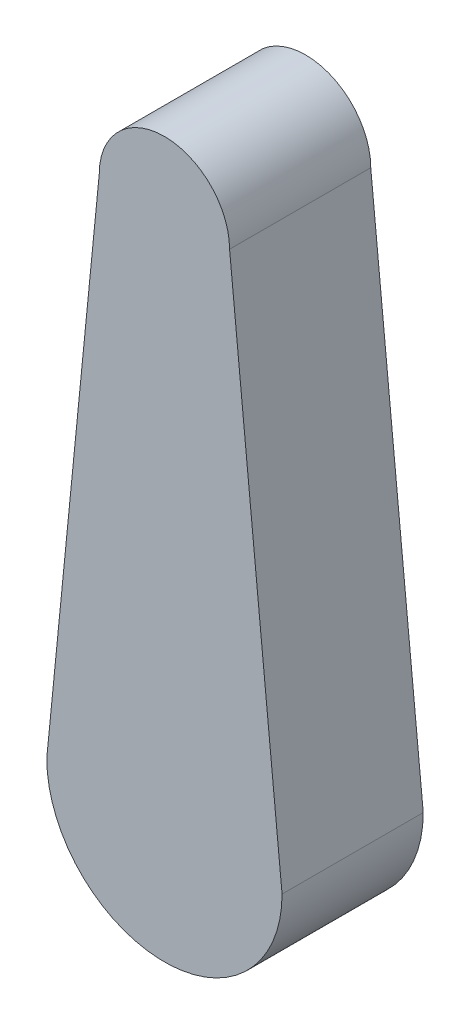
ISO-10303-21;
HEADER;
FILE_DESCRIPTION(('STEP AP214'),'2;1');
FILE_NAME('part.step','',(''),(''),'','','');
FILE_SCHEMA(('AUTOMOTIVE_DESIGN { 1 0 10303 214 1 1 1 1 }'));
ENDSEC;
DATA;
#1=APPLICATION_CONTEXT('core data for automotive mechanical design processes');
#2=APPLICATION_PROTOCOL_DEFINITION('international standard','automotive_design',2000,#1);
#3=PRODUCT_CONTEXT('',#1,'mechanical');
#4=PRODUCT('Part','Part','',(#3));
#5=PRODUCT_RELATED_PRODUCT_CATEGORY('part','',(#4));
#6=PRODUCT_DEFINITION_FORMATION('','',#4);
#7=PRODUCT_DEFINITION_CONTEXT('part definition',#1,'design');
#8=PRODUCT_DEFINITION('design','',#6,#7);
#9=PRODUCT_DEFINITION_SHAPE('','',#8);
#10=(LENGTH_UNIT() NAMED_UNIT(*) SI_UNIT(.MILLI.,.METRE.));
#11=(NAMED_UNIT(*) PLANE_ANGLE_UNIT() SI_UNIT($,.RADIAN.));
#12=(NAMED_UNIT(*) SI_UNIT($,.STERADIAN.) SOLID_ANGLE_UNIT());
#13=UNCERTAINTY_MEASURE_WITH_UNIT(LENGTH_MEASURE(1.E-05),#10,'distance_accuracy_value','');
#14=(GEOMETRIC_REPRESENTATION_CONTEXT(3) GLOBAL_UNCERTAINTY_ASSIGNED_CONTEXT((#13)) GLOBAL_UNIT_ASSIGNED_CONTEXT((#10,
#11,#12)) REPRESENTATION_CONTEXT('',''));
#15=CARTESIAN_POINT('',(0.,0.,0.));
#16=DIRECTION('',(0.,0.,1.));
#17=DIRECTION('',(1.,0.,0.));
#18=AXIS2_PLACEMENT_3D('',#15,#16,#17);
#19=CARTESIAN_POINT('',(-190.481077779291,76.9248464768424,-7.8));
#20=DIRECTION('',(0.,0.,1.));
#21=DIRECTION('',(1.,0.,0.));
#22=AXIS2_PLACEMENT_3D('',#19,#20,#21);
#23=CYLINDRICAL_SURFACE('',#22,6.50000000000001);
#24=CARTESIAN_POINT('',(-190.481077779291,76.9248464768424,0.));
#25=DIRECTION('',(0.,0.,1.));
#26=DIRECTION('',(1.,0.,0.));
#27=AXIS2_PLACEMENT_3D('',#24,#25,#26);
#28=CIRCLE('',#27,6.50000000000001);
#29=CARTESIAN_POINT('',(-196.981077779291,76.9248464768424,0.));
#30=VERTEX_POINT('',#29);
#31=CARTESIAN_POINT('',(-183.98107777929,76.9248464768424,0.));
#32=VERTEX_POINT('',#31);
#33=EDGE_CURVE('E121',#30,#32,#28,.T.);
#34=ORIENTED_EDGE('',*,*,#33,.F.);
#35=DIRECTION('',(0.,0.,1.));
#36=VECTOR('',#35,1.);
#37=CARTESIAN_POINT('',(-196.981077779291,76.9248464768424,-7.8));
#38=LINE('',#37,#36);
#39=CARTESIAN_POINT('',(-196.981077779291,76.9248464768424,-7.8));
#40=VERTEX_POINT('',#39);
#41=EDGE_CURVE('E11',#40,#30,#38,.T.);
#42=ORIENTED_EDGE('',*,*,#41,.F.);
#43=CARTESIAN_POINT('',(-190.481077779291,76.9248464768424,-7.8));
#44=DIRECTION('',(0.,0.,1.));
#45=DIRECTION('',(1.,0.,0.));
#46=AXIS2_PLACEMENT_3D('',#43,#44,#45);
#47=CIRCLE('',#46,6.50000000000001);
#48=CARTESIAN_POINT('',(-183.98107777929,76.9248464768424,-7.8));
#49=VERTEX_POINT('',#48);
#50=EDGE_CURVE('E111',#40,#49,#47,.T.);
#51=ORIENTED_EDGE('',*,*,#50,.T.);
#52=DIRECTION('',(0.,0.,1.));
#53=VECTOR('',#52,1.);
#54=CARTESIAN_POINT('',(-183.98107777929,76.9248464768424,-7.8));
#55=LINE('',#54,#53);
#56=EDGE_CURVE('E44',#49,#32,#55,.T.);
#57=ORIENTED_EDGE('',*,*,#56,.T.);
#58=EDGE_LOOP('',(#34,#42,#51,#57));
#59=FACE_BOUND('',#58,.T.);
#60=ADVANCED_FACE('F41',(#59),#23,.T.);
#61=CARTESIAN_POINT('',(-194.08107777929,106.324846476842,-7.8));
#62=DIRECTION('',(-0.995170343925355,0.0981630611354947,0.));
#63=DIRECTION('',(-0.0981630611354947,-0.995170343925355,0.));
#64=AXIS2_PLACEMENT_3D('',#61,#62,#63);
#65=PLANE('',#64);
#66=DIRECTION('',(-0.0981630611354947,-0.995170343925355,0.));
#67=VECTOR('',#66,1.);
#68=CARTESIAN_POINT('',(-194.08107777929,106.324846476842,0.));
#69=LINE('',#68,#67);
#70=CARTESIAN_POINT('',(-194.08107777929,106.324846476842,0.));
#71=VERTEX_POINT('',#70);
#72=EDGE_CURVE('E116',#71,#30,#69,.T.);
#73=ORIENTED_EDGE('',*,*,#72,.F.);
#74=DIRECTION('',(0.,0.,1.));
#75=VECTOR('',#74,1.);
#76=CARTESIAN_POINT('',(-194.08107777929,106.324846476842,-7.8));
#77=LINE('',#76,#75);
#78=CARTESIAN_POINT('',(-194.08107777929,106.324846476842,-7.8));
#79=VERTEX_POINT('',#78);
#80=EDGE_CURVE('E51',#79,#71,#77,.T.);
#81=ORIENTED_EDGE('',*,*,#80,.F.);
#82=DIRECTION('',(-0.0981630611354947,-0.995170343925355,0.));
#83=VECTOR('',#82,1.);
#84=CARTESIAN_POINT('',(-194.08107777929,106.324846476842,-7.8));
#85=LINE('',#84,#83);
#86=EDGE_CURVE('E106',#79,#40,#85,.T.);
#87=ORIENTED_EDGE('',*,*,#86,.T.);
#88=ORIENTED_EDGE('',*,*,#41,.T.);
#89=EDGE_LOOP('',(#73,#81,#87,#88));
#90=FACE_BOUND('',#89,.T.);
#91=ADVANCED_FACE('F134',(#90),#65,.T.);
#92=CARTESIAN_POINT('',(-190.481077779291,106.324846476842,-7.8));
#93=DIRECTION('',(0.,0.,1.));
#94=DIRECTION('',(1.,0.,0.));
#95=AXIS2_PLACEMENT_3D('',#92,#93,#94);
#96=CYLINDRICAL_SURFACE('',#95,3.59999999999999);
#97=CARTESIAN_POINT('',(-190.481077779291,106.324846476842,0.));
#98=DIRECTION('',(0.,0.,1.));
#99=DIRECTION('',(1.,0.,0.));
#100=AXIS2_PLACEMENT_3D('',#97,#98,#99);
#101=CIRCLE('',#100,3.59999999999999);
#102=CARTESIAN_POINT('',(-186.881077779291,106.324846476842,0.));
#103=VERTEX_POINT('',#102);
#104=EDGE_CURVE('E100',#103,#71,#101,.T.);
#105=ORIENTED_EDGE('',*,*,#104,.F.);
#106=DIRECTION('',(0.,0.,1.));
#107=VECTOR('',#106,1.);
#108=CARTESIAN_POINT('',(-186.881077779291,106.324846476842,-7.8));
#109=LINE('',#108,#107);
#110=CARTESIAN_POINT('',(-186.881077779291,106.324846476842,-7.8));
#111=VERTEX_POINT('',#110);
#112=EDGE_CURVE('E95',#111,#103,#109,.T.);
#113=ORIENTED_EDGE('',*,*,#112,.F.);
#114=CARTESIAN_POINT('',(-190.481077779291,106.324846476842,-7.8));
#115=DIRECTION('',(0.,0.,1.));
#116=DIRECTION('',(1.,0.,0.));
#117=AXIS2_PLACEMENT_3D('',#114,#115,#116);
#118=CIRCLE('',#117,3.59999999999999);
#119=EDGE_CURVE('E98',#111,#79,#118,.T.);
#120=ORIENTED_EDGE('',*,*,#119,.T.);
#121=ORIENTED_EDGE('',*,*,#80,.T.);
#122=EDGE_LOOP('',(#105,#113,#120,#121));
#123=FACE_BOUND('',#122,.T.);
#124=ADVANCED_FACE('F97',(#123),#96,.T.);
#125=CARTESIAN_POINT('',(-183.98107777929,76.9248464768424,-7.8));
#126=DIRECTION('',(0.995170343925355,0.0981630611354947,0.));
#127=DIRECTION('',(-0.0981630611354947,0.995170343925355,0.));
#128=AXIS2_PLACEMENT_3D('',#125,#126,#127);
#129=PLANE('',#128);
#130=DIRECTION('',(-0.0981630611354947,0.995170343925355,0.));
#131=VECTOR('',#130,1.);
#132=CARTESIAN_POINT('',(-183.98107777929,76.9248464768424,0.));
#133=LINE('',#132,#131);
#134=EDGE_CURVE('E124',#32,#103,#133,.T.);
#135=ORIENTED_EDGE('',*,*,#134,.F.);
#136=ORIENTED_EDGE('',*,*,#56,.F.);
#137=DIRECTION('',(-0.0981630611354947,0.995170343925355,0.));
#138=VECTOR('',#137,1.);
#139=CARTESIAN_POINT('',(-183.98107777929,76.9248464768424,-7.8));
#140=LINE('',#139,#138);
#141=EDGE_CURVE('E105',#49,#111,#140,.T.);
#142=ORIENTED_EDGE('',*,*,#141,.T.);
#143=ORIENTED_EDGE('',*,*,#112,.T.);
#144=EDGE_LOOP('',(#135,#136,#142,#143));
#145=FACE_BOUND('',#144,.T.);
#146=ADVANCED_FACE('F109',(#145),#129,.T.);
#147=CARTESIAN_POINT('',(-190.481077779291,76.9248464768424,-7.8));
#148=DIRECTION('',(0.,0.,1.));
#149=DIRECTION('',(1.,0.,0.));
#150=AXIS2_PLACEMENT_3D('',#147,#148,#149);
#151=PLANE('',#150);
#152=ORIENTED_EDGE('',*,*,#50,.F.);
#153=ORIENTED_EDGE('',*,*,#86,.F.);
#154=ORIENTED_EDGE('',*,*,#119,.F.);
#155=ORIENTED_EDGE('',*,*,#141,.F.);
#156=EDGE_LOOP('',(#152,#153,#154,#155));
#157=FACE_BOUND('',#156,.T.);
#158=ADVANCED_FACE('F104',(#157),#151,.F.);
#159=CARTESIAN_POINT('',(-190.481077779291,76.9248464768424,0.));
#160=DIRECTION('',(0.,0.,1.));
#161=DIRECTION('',(1.,0.,0.));
#162=AXIS2_PLACEMENT_3D('',#159,#160,#161);
#163=PLANE('',#162);
#164=ORIENTED_EDGE('',*,*,#33,.T.);
#165=ORIENTED_EDGE('',*,*,#134,.T.);
#166=ORIENTED_EDGE('',*,*,#104,.T.);
#167=ORIENTED_EDGE('',*,*,#72,.T.);
#168=EDGE_LOOP('',(#164,#165,#166,#167));
#169=FACE_BOUND('',#168,.T.);
#170=ADVANCED_FACE('F133',(#169),#163,.T.);
#171=CLOSED_SHELL('',(#60,#91,#124,#146,#158,#170));
#172=MANIFOLD_SOLID_BREP('B2',#171);
#173=ADVANCED_BREP_SHAPE_REPRESENTATION('',(#18,#172),#14);
#174=SHAPE_DEFINITION_REPRESENTATION(#9,#173);
ENDSEC;
END-ISO-10303-21;
